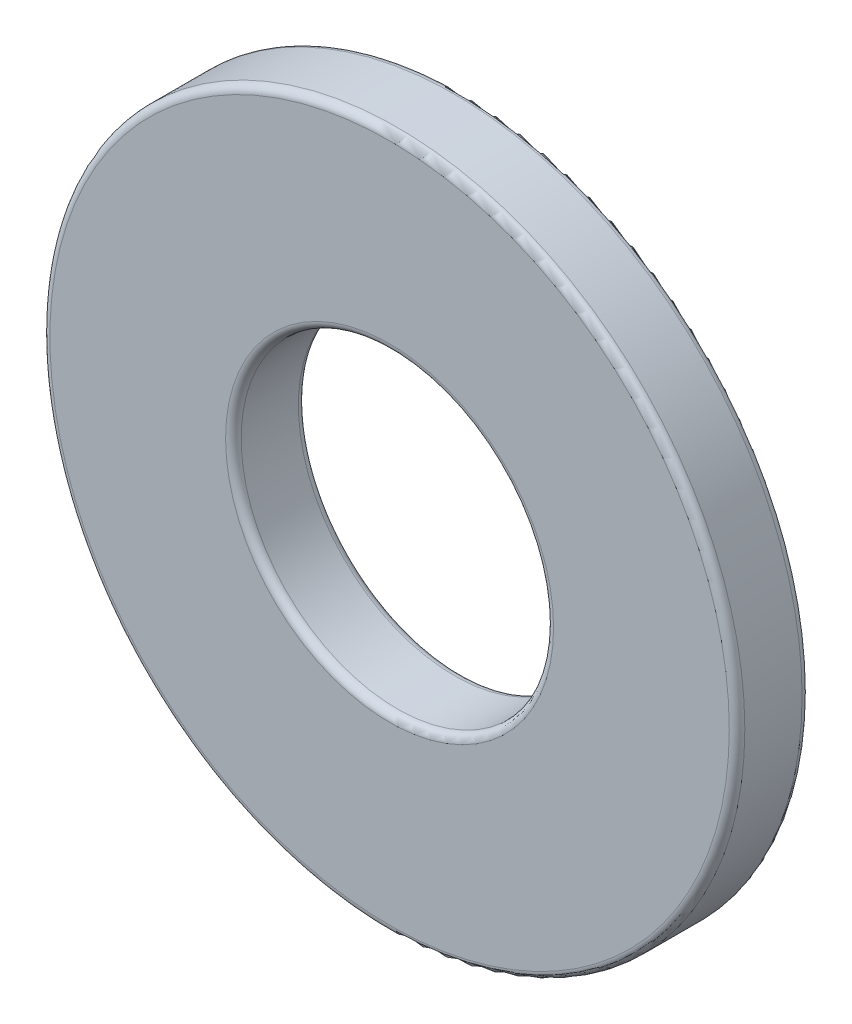
ISO-10303-21;
HEADER;
FILE_DESCRIPTION(('STEP AP214'),'2;1');
FILE_NAME('part.step','',(''),(''),'','','');
FILE_SCHEMA(('AUTOMOTIVE_DESIGN { 1 0 10303 214 1 1 1 1 }'));
ENDSEC;
DATA;
#1=APPLICATION_CONTEXT('core data for automotive mechanical design processes');
#2=APPLICATION_PROTOCOL_DEFINITION('international standard','automotive_design',2000,#1);
#3=PRODUCT_CONTEXT('',#1,'mechanical');
#4=PRODUCT('Part','Part','',(#3));
#5=PRODUCT_RELATED_PRODUCT_CATEGORY('part','',(#4));
#6=PRODUCT_DEFINITION_FORMATION('','',#4);
#7=PRODUCT_DEFINITION_CONTEXT('part definition',#1,'design');
#8=PRODUCT_DEFINITION('design','',#6,#7);
#9=PRODUCT_DEFINITION_SHAPE('','',#8);
#10=(LENGTH_UNIT() NAMED_UNIT(*) SI_UNIT(.MILLI.,.METRE.));
#11=(NAMED_UNIT(*) PLANE_ANGLE_UNIT() SI_UNIT($,.RADIAN.));
#12=(NAMED_UNIT(*) SI_UNIT($,.STERADIAN.) SOLID_ANGLE_UNIT());
#13=UNCERTAINTY_MEASURE_WITH_UNIT(LENGTH_MEASURE(1.E-05),#10,'distance_accuracy_value','');
#14=(GEOMETRIC_REPRESENTATION_CONTEXT(3) GLOBAL_UNCERTAINTY_ASSIGNED_CONTEXT((#13)) GLOBAL_UNIT_ASSIGNED_CONTEXT((#10,
#11,#12)) REPRESENTATION_CONTEXT('',''));
#15=CARTESIAN_POINT('',(0.,0.,0.));
#16=DIRECTION('',(0.,0.,1.));
#17=DIRECTION('',(1.,0.,0.));
#18=AXIS2_PLACEMENT_3D('',#15,#16,#17);
#19=CARTESIAN_POINT('',(0.,0.,0.83185));
#20=DIRECTION('',(0.,0.,1.));
#21=DIRECTION('',(1.,0.,0.));
#22=AXIS2_PLACEMENT_3D('',#19,#20,#21);
#23=PLANE('',#22);
#24=CARTESIAN_POINT('',(0.,0.,0.83185));
#25=DIRECTION('',(0.,0.,1.));
#26=DIRECTION('',(1.,0.,0.));
#27=AXIS2_PLACEMENT_3D('',#24,#25,#26);
#28=CIRCLE('',#27,3.7465);
#29=CARTESIAN_POINT('',(3.7465,0.,0.83185));
#30=VERTEX_POINT('',#29);
#31=EDGE_CURVE('E61',#30,#30,#28,.F.);
#32=ORIENTED_EDGE('',*,*,#31,.T.);
#33=EDGE_LOOP('',(#32));
#34=FACE_BOUND('',#33,.T.);
#35=CARTESIAN_POINT('',(0.,0.,0.83185));
#36=DIRECTION('',(0.,0.,1.));
#37=DIRECTION('',(1.,0.,0.));
#38=AXIS2_PLACEMENT_3D('',#35,#36,#37);
#39=CIRCLE('',#38,7.7597);
#40=CARTESIAN_POINT('',(7.7597,0.,0.83185));
#41=VERTEX_POINT('',#40);
#42=EDGE_CURVE('E64',#41,#41,#39,.T.);
#43=ORIENTED_EDGE('',*,*,#42,.T.);
#44=EDGE_LOOP('',(#43));
#45=FACE_BOUND('',#44,.T.);
#46=ADVANCED_FACE('F41',(#34,#45),#23,.T.);
#47=CARTESIAN_POINT('',(0.,0.,-0.83185));
#48=DIRECTION('',(0.,0.,1.));
#49=DIRECTION('',(1.,0.,0.));
#50=AXIS2_PLACEMENT_3D('',#47,#48,#49);
#51=PLANE('',#50);
#52=CARTESIAN_POINT('',(0.,0.,-0.83185));
#53=DIRECTION('',(0.,0.,1.));
#54=DIRECTION('',(1.,0.,0.));
#55=AXIS2_PLACEMENT_3D('',#52,#53,#54);
#56=CIRCLE('',#55,3.7465);
#57=CARTESIAN_POINT('',(3.7465,0.,-0.83185));
#58=VERTEX_POINT('',#57);
#59=EDGE_CURVE('E10',#58,#58,#56,.T.);
#60=ORIENTED_EDGE('',*,*,#59,.T.);
#61=EDGE_LOOP('',(#60));
#62=FACE_BOUND('',#61,.T.);
#63=CARTESIAN_POINT('',(0.,0.,-0.83185));
#64=DIRECTION('',(0.,0.,1.));
#65=DIRECTION('',(1.,0.,0.));
#66=AXIS2_PLACEMENT_3D('',#63,#64,#65);
#67=CIRCLE('',#66,7.7597);
#68=CARTESIAN_POINT('',(7.7597,0.,-0.83185));
#69=VERTEX_POINT('',#68);
#70=EDGE_CURVE('E48',#69,#69,#67,.F.);
#71=ORIENTED_EDGE('',*,*,#70,.T.);
#72=EDGE_LOOP('',(#71));
#73=FACE_BOUND('',#72,.T.);
#74=ADVANCED_FACE('F89',(#62,#73),#51,.F.);
#75=CARTESIAN_POINT('',(0.,0.,0.83185));
#76=DIRECTION('',(0.,0.,-1.));
#77=DIRECTION('',(-1.,0.,0.));
#78=AXIS2_PLACEMENT_3D('',#75,#76,#77);
#79=CYLINDRICAL_SURFACE('',#78,7.9375);
#80=CARTESIAN_POINT('',(0.,0.,0.65405));
#81=DIRECTION('',(0.,0.,1.));
#82=DIRECTION('',(1.,0.,0.));
#83=AXIS2_PLACEMENT_3D('',#80,#81,#82);
#84=CIRCLE('',#83,7.9375);
#85=CARTESIAN_POINT('',(7.9375,0.,0.65405));
#86=VERTEX_POINT('',#85);
#87=EDGE_CURVE('E52',#86,#86,#84,.F.);
#88=ORIENTED_EDGE('',*,*,#87,.T.);
#89=EDGE_LOOP('',(#88));
#90=FACE_BOUND('',#89,.T.);
#91=CARTESIAN_POINT('',(0.,0.,-0.65405));
#92=DIRECTION('',(0.,0.,1.));
#93=DIRECTION('',(1.,0.,0.));
#94=AXIS2_PLACEMENT_3D('',#91,#92,#93);
#95=CIRCLE('',#94,7.9375);
#96=CARTESIAN_POINT('',(7.9375,0.,-0.65405));
#97=VERTEX_POINT('',#96);
#98=EDGE_CURVE('E56',#97,#97,#95,.T.);
#99=ORIENTED_EDGE('',*,*,#98,.T.);
#100=EDGE_LOOP('',(#99));
#101=FACE_BOUND('',#100,.T.);
#102=ADVANCED_FACE('F95',(#90,#101),#79,.T.);
#103=CARTESIAN_POINT('',(0.,0.,0.83185));
#104=DIRECTION('',(0.,0.,-1.));
#105=DIRECTION('',(-1.,0.,0.));
#106=AXIS2_PLACEMENT_3D('',#103,#104,#105);
#107=CYLINDRICAL_SURFACE('',#106,3.5687);
#108=CARTESIAN_POINT('',(0.,0.,0.65405));
#109=DIRECTION('',(0.,0.,1.));
#110=DIRECTION('',(1.,0.,0.));
#111=AXIS2_PLACEMENT_3D('',#108,#109,#110);
#112=CIRCLE('',#111,3.5687);
#113=CARTESIAN_POINT('',(3.5687,0.,0.65405));
#114=VERTEX_POINT('',#113);
#115=EDGE_CURVE('E67',#114,#114,#112,.T.);
#116=ORIENTED_EDGE('',*,*,#115,.T.);
#117=EDGE_LOOP('',(#116));
#118=FACE_BOUND('',#117,.T.);
#119=CARTESIAN_POINT('',(0.,0.,-0.65405));
#120=DIRECTION('',(0.,0.,1.));
#121=DIRECTION('',(1.,0.,0.));
#122=AXIS2_PLACEMENT_3D('',#119,#120,#121);
#123=CIRCLE('',#122,3.5687);
#124=CARTESIAN_POINT('',(3.5687,0.,-0.65405));
#125=VERTEX_POINT('',#124);
#126=EDGE_CURVE('E70',#125,#125,#123,.F.);
#127=ORIENTED_EDGE('',*,*,#126,.T.);
#128=EDGE_LOOP('',(#127));
#129=FACE_BOUND('',#128,.T.);
#130=ADVANCED_FACE('F74',(#118,#129),#107,.F.);
#131=CARTESIAN_POINT('',(0.,0.,0.65405));
#132=DIRECTION('',(0.,0.,1.));
#133=DIRECTION('',(1.,0.,0.));
#134=AXIS2_PLACEMENT_3D('',#131,#132,#133);
#135=TOROIDAL_SURFACE('',#134,3.7465,0.1778);
#136=ORIENTED_EDGE('',*,*,#31,.F.);
#137=EDGE_LOOP('',(#136));
#138=FACE_BOUND('',#137,.T.);
#139=ORIENTED_EDGE('',*,*,#115,.F.);
#140=EDGE_LOOP('',(#139));
#141=FACE_BOUND('',#140,.T.);
#142=ADVANCED_FACE('F85',(#138,#141),#135,.T.);
#143=CARTESIAN_POINT('',(0.,0.,0.65405));
#144=DIRECTION('',(0.,0.,1.));
#145=DIRECTION('',(1.,0.,0.));
#146=AXIS2_PLACEMENT_3D('',#143,#144,#145);
#147=TOROIDAL_SURFACE('',#146,7.7597,0.1778);
#148=ORIENTED_EDGE('',*,*,#87,.F.);
#149=EDGE_LOOP('',(#148));
#150=FACE_BOUND('',#149,.T.);
#151=ORIENTED_EDGE('',*,*,#42,.F.);
#152=EDGE_LOOP('',(#151));
#153=FACE_BOUND('',#152,.T.);
#154=ADVANCED_FACE('F79',(#150,#153),#147,.T.);
#155=CARTESIAN_POINT('',(0.,0.,-0.65405));
#156=DIRECTION('',(0.,0.,1.));
#157=DIRECTION('',(1.,0.,0.));
#158=AXIS2_PLACEMENT_3D('',#155,#156,#157);
#159=TOROIDAL_SURFACE('',#158,3.7465,0.1778);
#160=ORIENTED_EDGE('',*,*,#126,.F.);
#161=EDGE_LOOP('',(#160));
#162=FACE_BOUND('',#161,.T.);
#163=ORIENTED_EDGE('',*,*,#59,.F.);
#164=EDGE_LOOP('',(#163));
#165=FACE_BOUND('',#164,.T.);
#166=ADVANCED_FACE('F76',(#162,#165),#159,.T.);
#167=CARTESIAN_POINT('',(0.,0.,-0.65405));
#168=DIRECTION('',(0.,0.,1.));
#169=DIRECTION('',(1.,0.,0.));
#170=AXIS2_PLACEMENT_3D('',#167,#168,#169);
#171=TOROIDAL_SURFACE('',#170,7.7597,0.1778);
#172=ORIENTED_EDGE('',*,*,#70,.F.);
#173=EDGE_LOOP('',(#172));
#174=FACE_BOUND('',#173,.T.);
#175=ORIENTED_EDGE('',*,*,#98,.F.);
#176=EDGE_LOOP('',(#175));
#177=FACE_BOUND('',#176,.T.);
#178=ADVANCED_FACE('F43',(#174,#177),#171,.T.);
#179=CLOSED_SHELL('',(#46,#74,#102,#130,#142,#154,#166,#178));
#180=MANIFOLD_SOLID_BREP('B2',#179);
#181=ADVANCED_BREP_SHAPE_REPRESENTATION('',(#18,#180),#14);
#182=SHAPE_DEFINITION_REPRESENTATION(#9,#181);
ENDSEC;
END-ISO-10303-21;
